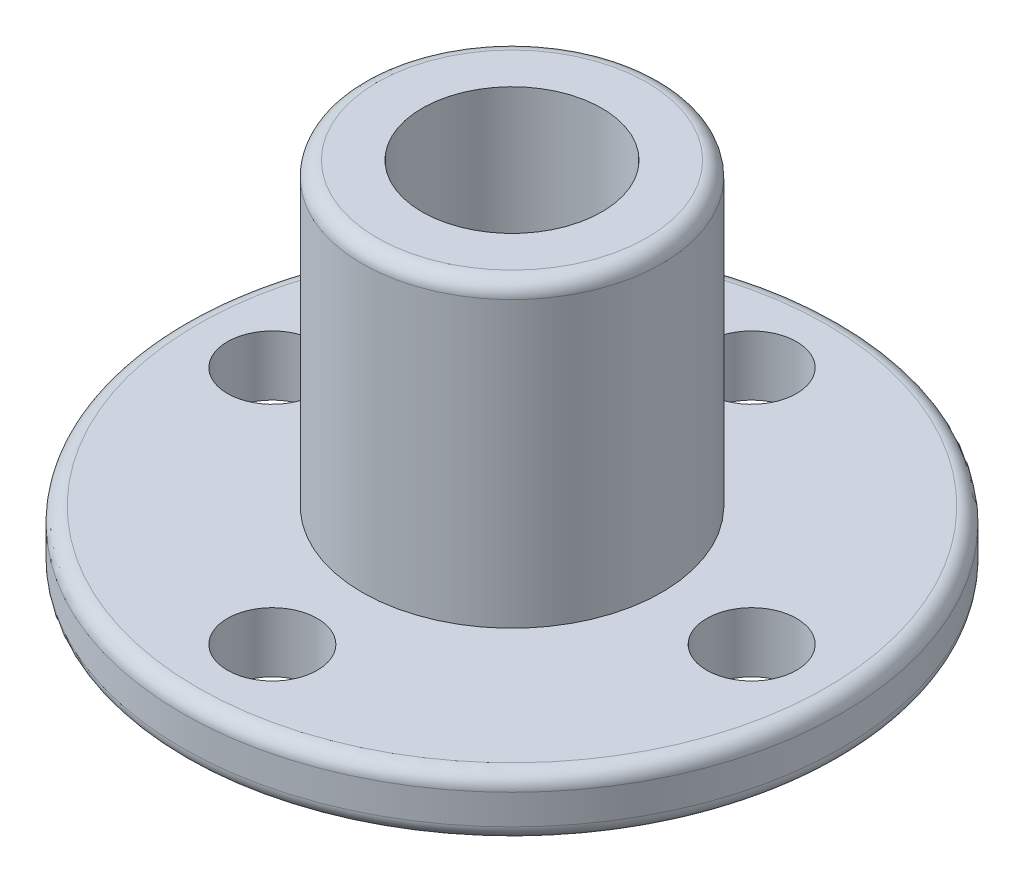
ISO-10303-21;
HEADER;
FILE_DESCRIPTION(('STEP AP214'),'2;1');
FILE_NAME('part.step','',(''),(''),'','','');
FILE_SCHEMA(('AUTOMOTIVE_DESIGN { 1 0 10303 214 1 1 1 1 }'));
ENDSEC;
DATA;
#1=APPLICATION_CONTEXT('core data for automotive mechanical design processes');
#2=APPLICATION_PROTOCOL_DEFINITION('international standard','automotive_design',2000,#1);
#3=PRODUCT_CONTEXT('',#1,'mechanical');
#4=PRODUCT('Part','Part','',(#3));
#5=PRODUCT_RELATED_PRODUCT_CATEGORY('part','',(#4));
#6=PRODUCT_DEFINITION_FORMATION('','',#4);
#7=PRODUCT_DEFINITION_CONTEXT('part definition',#1,'design');
#8=PRODUCT_DEFINITION('design','',#6,#7);
#9=PRODUCT_DEFINITION_SHAPE('','',#8);
#10=(LENGTH_UNIT() NAMED_UNIT(*) SI_UNIT(.MILLI.,.METRE.));
#11=(NAMED_UNIT(*) PLANE_ANGLE_UNIT() SI_UNIT($,.RADIAN.));
#12=(NAMED_UNIT(*) SI_UNIT($,.STERADIAN.) SOLID_ANGLE_UNIT());
#13=UNCERTAINTY_MEASURE_WITH_UNIT(LENGTH_MEASURE(1.E-05),#10,'distance_accuracy_value','');
#14=(GEOMETRIC_REPRESENTATION_CONTEXT(3) GLOBAL_UNCERTAINTY_ASSIGNED_CONTEXT((#13)) GLOBAL_UNIT_ASSIGNED_CONTEXT((#10,
#11,#12)) REPRESENTATION_CONTEXT('',''));
#15=CARTESIAN_POINT('',(0.,0.,0.));
#16=DIRECTION('',(0.,0.,1.));
#17=DIRECTION('',(1.,0.,0.));
#18=AXIS2_PLACEMENT_3D('',#15,#16,#17);
#19=CARTESIAN_POINT('',(0.,2.,0.));
#20=DIRECTION('',(0.,-1.,0.));
#21=DIRECTION('',(0.,0.,-1.));
#22=AXIS2_PLACEMENT_3D('',#19,#20,#21);
#23=CYLINDRICAL_SURFACE('',#22,11.);
#24=CARTESIAN_POINT('',(0.,0.5,0.));
#25=DIRECTION('',(0.,1.,0.));
#26=DIRECTION('',(0.,0.,1.));
#27=AXIS2_PLACEMENT_3D('',#24,#25,#26);
#28=CIRCLE('',#27,11.);
#29=CARTESIAN_POINT('',(0.,0.5,11.));
#30=VERTEX_POINT('',#29);
#31=EDGE_CURVE('E57',#30,#30,#28,.T.);
#32=ORIENTED_EDGE('',*,*,#31,.T.);
#33=EDGE_LOOP('',(#32));
#34=FACE_BOUND('',#33,.T.);
#35=CARTESIAN_POINT('',(0.,1.5,0.));
#36=DIRECTION('',(0.,1.,0.));
#37=DIRECTION('',(0.,0.,1.));
#38=AXIS2_PLACEMENT_3D('',#35,#36,#37);
#39=CIRCLE('',#38,11.);
#40=CARTESIAN_POINT('',(0.,1.5,11.));
#41=VERTEX_POINT('',#40);
#42=EDGE_CURVE('E60',#41,#41,#39,.F.);
#43=ORIENTED_EDGE('',*,*,#42,.T.);
#44=EDGE_LOOP('',(#43));
#45=FACE_BOUND('',#44,.T.);
#46=ADVANCED_FACE('F37',(#34,#45),#23,.T.);
#47=CARTESIAN_POINT('',(0.,2.,0.));
#48=DIRECTION('',(0.,1.,0.));
#49=DIRECTION('',(0.,0.,1.));
#50=AXIS2_PLACEMENT_3D('',#47,#48,#49);
#51=PLANE('',#50);
#52=CARTESIAN_POINT('',(0.,2.,0.));
#53=DIRECTION('',(0.,1.,0.));
#54=DIRECTION('',(0.,0.,1.));
#55=AXIS2_PLACEMENT_3D('',#52,#53,#54);
#56=CIRCLE('',#55,10.5);
#57=CARTESIAN_POINT('',(0.,2.,10.5));
#58=VERTEX_POINT('',#57);
#59=EDGE_CURVE('E48',#58,#58,#56,.T.);
#60=ORIENTED_EDGE('',*,*,#59,.T.);
#61=EDGE_LOOP('',(#60));
#62=FACE_BOUND('',#61,.T.);
#63=CARTESIAN_POINT('',(0.,2.,0.));
#64=DIRECTION('',(0.,1.,0.));
#65=DIRECTION('',(0.,0.,1.));
#66=AXIS2_PLACEMENT_3D('',#63,#64,#65);
#67=CIRCLE('',#66,5.);
#68=CARTESIAN_POINT('',(0.,2.,5.));
#69=VERTEX_POINT('',#68);
#70=EDGE_CURVE('E68',#69,#69,#67,.T.);
#71=ORIENTED_EDGE('',*,*,#70,.F.);
#72=EDGE_LOOP('',(#71));
#73=FACE_BOUND('',#72,.T.);
#74=CARTESIAN_POINT('',(0.,2.,-8.));
#75=DIRECTION('',(0.,1.,0.));
#76=DIRECTION('',(0.,0.,1.));
#77=AXIS2_PLACEMENT_3D('',#74,#75,#76);
#78=CIRCLE('',#77,1.5);
#79=CARTESIAN_POINT('',(0.,2.,-6.5));
#80=VERTEX_POINT('',#79);
#81=EDGE_CURVE('E83',#80,#80,#78,.T.);
#82=ORIENTED_EDGE('',*,*,#81,.F.);
#83=EDGE_LOOP('',(#82));
#84=FACE_BOUND('',#83,.T.);
#85=CARTESIAN_POINT('',(8.,2.,0.));
#86=DIRECTION('',(0.,1.,0.));
#87=DIRECTION('',(0.,0.,1.));
#88=AXIS2_PLACEMENT_3D('',#85,#86,#87);
#89=CIRCLE('',#88,1.5);
#90=CARTESIAN_POINT('',(8.,2.,1.5));
#91=VERTEX_POINT('',#90);
#92=EDGE_CURVE('E80',#91,#91,#89,.T.);
#93=ORIENTED_EDGE('',*,*,#92,.F.);
#94=EDGE_LOOP('',(#93));
#95=FACE_BOUND('',#94,.T.);
#96=CARTESIAN_POINT('',(0.,2.,8.));
#97=DIRECTION('',(0.,1.,0.));
#98=DIRECTION('',(0.,0.,1.));
#99=AXIS2_PLACEMENT_3D('',#96,#97,#98);
#100=CIRCLE('',#99,1.5);
#101=CARTESIAN_POINT('',(0.,2.,9.5));
#102=VERTEX_POINT('',#101);
#103=EDGE_CURVE('E74',#102,#102,#100,.T.);
#104=ORIENTED_EDGE('',*,*,#103,.F.);
#105=EDGE_LOOP('',(#104));
#106=FACE_BOUND('',#105,.T.);
#107=CARTESIAN_POINT('',(-8.,2.,0.));
#108=DIRECTION('',(0.,1.,0.));
#109=DIRECTION('',(0.,0.,1.));
#110=AXIS2_PLACEMENT_3D('',#107,#108,#109);
#111=CIRCLE('',#110,1.5);
#112=CARTESIAN_POINT('',(-8.,2.,1.5));
#113=VERTEX_POINT('',#112);
#114=EDGE_CURVE('E67',#113,#113,#111,.T.);
#115=ORIENTED_EDGE('',*,*,#114,.F.);
#116=EDGE_LOOP('',(#115));
#117=FACE_BOUND('',#116,.T.);
#118=ADVANCED_FACE('F146',(#62,#73,#84,#95,#106,#117),#51,.T.);
#119=CARTESIAN_POINT('',(0.,0.,0.));
#120=DIRECTION('',(0.,1.,0.));
#121=DIRECTION('',(0.,0.,1.));
#122=AXIS2_PLACEMENT_3D('',#119,#120,#121);
#123=PLANE('',#122);
#124=CARTESIAN_POINT('',(0.,0.,0.));
#125=DIRECTION('',(0.,1.,0.));
#126=DIRECTION('',(0.,0.,1.));
#127=AXIS2_PLACEMENT_3D('',#124,#125,#126);
#128=CIRCLE('',#127,10.5);
#129=CARTESIAN_POINT('',(0.,0.,10.5));
#130=VERTEX_POINT('',#129);
#131=EDGE_CURVE('E52',#130,#130,#128,.F.);
#132=ORIENTED_EDGE('',*,*,#131,.T.);
#133=EDGE_LOOP('',(#132));
#134=FACE_BOUND('',#133,.T.);
#135=CARTESIAN_POINT('',(0.,0.,0.));
#136=DIRECTION('',(0.,1.,0.));
#137=DIRECTION('',(0.,0.,1.));
#138=AXIS2_PLACEMENT_3D('',#135,#136,#137);
#139=CIRCLE('',#138,3.);
#140=CARTESIAN_POINT('',(0.,0.,3.));
#141=VERTEX_POINT('',#140);
#142=EDGE_CURVE('E90',#141,#141,#139,.T.);
#143=ORIENTED_EDGE('',*,*,#142,.T.);
#144=EDGE_LOOP('',(#143));
#145=FACE_BOUND('',#144,.T.);
#146=CARTESIAN_POINT('',(0.,0.,-8.));
#147=DIRECTION('',(0.,1.,0.));
#148=DIRECTION('',(0.,0.,1.));
#149=AXIS2_PLACEMENT_3D('',#146,#147,#148);
#150=CIRCLE('',#149,1.5);
#151=CARTESIAN_POINT('',(0.,0.,-6.5));
#152=VERTEX_POINT('',#151);
#153=EDGE_CURVE('E63',#152,#152,#150,.T.);
#154=ORIENTED_EDGE('',*,*,#153,.T.);
#155=EDGE_LOOP('',(#154));
#156=FACE_BOUND('',#155,.T.);
#157=CARTESIAN_POINT('',(8.,0.,0.));
#158=DIRECTION('',(0.,1.,0.));
#159=DIRECTION('',(0.,0.,1.));
#160=AXIS2_PLACEMENT_3D('',#157,#158,#159);
#161=CIRCLE('',#160,1.5);
#162=CARTESIAN_POINT('',(8.,0.,1.5));
#163=VERTEX_POINT('',#162);
#164=EDGE_CURVE('E77',#163,#163,#161,.T.);
#165=ORIENTED_EDGE('',*,*,#164,.T.);
#166=EDGE_LOOP('',(#165));
#167=FACE_BOUND('',#166,.T.);
#168=CARTESIAN_POINT('',(0.,0.,8.));
#169=DIRECTION('',(0.,1.,0.));
#170=DIRECTION('',(0.,0.,1.));
#171=AXIS2_PLACEMENT_3D('',#168,#169,#170);
#172=CIRCLE('',#171,1.5);
#173=CARTESIAN_POINT('',(0.,0.,9.5));
#174=VERTEX_POINT('',#173);
#175=EDGE_CURVE('E71',#174,#174,#172,.T.);
#176=ORIENTED_EDGE('',*,*,#175,.T.);
#177=EDGE_LOOP('',(#176));
#178=FACE_BOUND('',#177,.T.);
#179=CARTESIAN_POINT('',(-8.,0.,0.));
#180=DIRECTION('',(0.,1.,0.));
#181=DIRECTION('',(0.,0.,1.));
#182=AXIS2_PLACEMENT_3D('',#179,#180,#181);
#183=CIRCLE('',#182,1.5);
#184=CARTESIAN_POINT('',(-8.,0.,1.5));
#185=VERTEX_POINT('',#184);
#186=EDGE_CURVE('E64',#185,#185,#183,.T.);
#187=ORIENTED_EDGE('',*,*,#186,.T.);
#188=EDGE_LOOP('',(#187));
#189=FACE_BOUND('',#188,.T.);
#190=ADVANCED_FACE('F144',(#134,#145,#156,#167,#178,#189),#123,.F.);
#191=CARTESIAN_POINT('',(-8.,0.,0.));
#192=DIRECTION('',(0.,1.,0.));
#193=DIRECTION('',(0.,0.,1.));
#194=AXIS2_PLACEMENT_3D('',#191,#192,#193);
#195=CYLINDRICAL_SURFACE('',#194,1.5);
#196=ORIENTED_EDGE('',*,*,#186,.F.);
#197=EDGE_LOOP('',(#196));
#198=FACE_BOUND('',#197,.T.);
#199=ORIENTED_EDGE('',*,*,#114,.T.);
#200=EDGE_LOOP('',(#199));
#201=FACE_BOUND('',#200,.T.);
#202=ADVANCED_FACE('F140',(#198,#201),#195,.F.);
#203=CARTESIAN_POINT('',(0.,0.,8.));
#204=DIRECTION('',(0.,1.,0.));
#205=DIRECTION('',(0.,0.,1.));
#206=AXIS2_PLACEMENT_3D('',#203,#204,#205);
#207=CYLINDRICAL_SURFACE('',#206,1.5);
#208=ORIENTED_EDGE('',*,*,#175,.F.);
#209=EDGE_LOOP('',(#208));
#210=FACE_BOUND('',#209,.T.);
#211=ORIENTED_EDGE('',*,*,#103,.T.);
#212=EDGE_LOOP('',(#211));
#213=FACE_BOUND('',#212,.T.);
#214=ADVANCED_FACE('F136',(#210,#213),#207,.F.);
#215=CARTESIAN_POINT('',(8.,0.,0.));
#216=DIRECTION('',(0.,1.,0.));
#217=DIRECTION('',(0.,0.,1.));
#218=AXIS2_PLACEMENT_3D('',#215,#216,#217);
#219=CYLINDRICAL_SURFACE('',#218,1.5);
#220=ORIENTED_EDGE('',*,*,#164,.F.);
#221=EDGE_LOOP('',(#220));
#222=FACE_BOUND('',#221,.T.);
#223=ORIENTED_EDGE('',*,*,#92,.T.);
#224=EDGE_LOOP('',(#223));
#225=FACE_BOUND('',#224,.T.);
#226=ADVANCED_FACE('F132',(#222,#225),#219,.F.);
#227=CARTESIAN_POINT('',(0.,0.,-8.));
#228=DIRECTION('',(0.,1.,0.));
#229=DIRECTION('',(0.,0.,1.));
#230=AXIS2_PLACEMENT_3D('',#227,#228,#229);
#231=CYLINDRICAL_SURFACE('',#230,1.5);
#232=ORIENTED_EDGE('',*,*,#153,.F.);
#233=EDGE_LOOP('',(#232));
#234=FACE_BOUND('',#233,.T.);
#235=ORIENTED_EDGE('',*,*,#81,.T.);
#236=EDGE_LOOP('',(#235));
#237=FACE_BOUND('',#236,.T.);
#238=ADVANCED_FACE('F128',(#234,#237),#231,.F.);
#239=CARTESIAN_POINT('',(0.,12.,0.));
#240=DIRECTION('',(0.,-1.,0.));
#241=DIRECTION('',(0.,0.,-1.));
#242=AXIS2_PLACEMENT_3D('',#239,#240,#241);
#243=CYLINDRICAL_SURFACE('',#242,5.);
#244=CARTESIAN_POINT('',(1.5,7.,-4.76969600708473));
#245=CARTESIAN_POINT('',(1.49999897633764,6.9178054520576,-4.7696968572698));
#246=CARTESIAN_POINT('',(1.49322108167142,6.83560077585598,-4.77184390209069));
#247=CARTESIAN_POINT('',(1.46635844446749,6.67359475040806,-4.780165783029));
#248=CARTESIAN_POINT('',(1.44626925573578,6.59379421349853,-4.78634196493468));
#249=CARTESIAN_POINT('',(1.39352753269955,6.43896527172827,-4.80196102485633));
#250=CARTESIAN_POINT('',(1.36089589394243,6.36392917036691,-4.81139846703232));
#251=CARTESIAN_POINT('',(1.28406421917929,6.2203780660047,-4.83246932547567));
#252=CARTESIAN_POINT('',(1.23986245137053,6.15186404131556,-4.8441030704102));
#253=CARTESIAN_POINT('',(1.13964754141627,6.02113360942262,-4.86866862185766));
#254=CARTESIAN_POINT('',(1.08333207175807,5.95915410205371,-4.88162808311636));
#255=CARTESIAN_POINT('',(0.961136237579598,5.84536204867749,-4.90714861936757));
#256=CARTESIAN_POINT('',(0.895254645461111,5.79355080955012,-4.91970964297705));
#257=CARTESIAN_POINT('',(0.754111437793689,5.70053730016669,-4.94333214579389));
#258=CARTESIAN_POINT('',(0.678684021335814,5.65957657555719,-4.95435724342404));
#259=CARTESIAN_POINT('',(0.521624645369353,5.59101274095724,-4.97334435920684));
#260=CARTESIAN_POINT('',(0.43999402838791,5.56340675014255,-4.98130703789496));
#261=CARTESIAN_POINT('',(0.275323852630828,5.52311999890949,-4.9930764600359));
#262=CARTESIAN_POINT('',(0.192391398953799,5.5100348723473,-4.99699557369339));
#263=CARTESIAN_POINT('',(0.0254218237493133,5.49788267535356,-5.00063201501348));
#264=CARTESIAN_POINT('',(-0.0586150620503699,5.49881266059804,-5.00035022521079));
#265=CARTESIAN_POINT('',(-0.222571156600162,5.51439286854302,-4.99569603817659));
#266=CARTESIAN_POINT('',(-0.302536267641343,5.52860519380987,-4.9914542020526));
#267=CARTESIAN_POINT('',(-0.458889213442528,5.56963133599429,-4.97951522112593));
#268=CARTESIAN_POINT('',(-0.535276821322847,5.59644595094267,-4.97181785750586));
#269=CARTESIAN_POINT('',(-0.683347326351282,5.66221202341856,-4.95365220986963));
#270=CARTESIAN_POINT('',(-0.75496506469448,5.70130120280727,-4.94315269676706));
#271=CARTESIAN_POINT('',(-0.890764673783157,5.79039785242823,-4.92049640648069));
#272=CARTESIAN_POINT('',(-0.954944774872132,5.84040791296349,-4.90833923637778));
#273=CARTESIAN_POINT('',(-1.0766604815298,5.9521977507516,-4.88311550488166));
#274=CARTESIAN_POINT('',(-1.13384458040112,6.01435691902974,-4.87003195321461));
#275=CARTESIAN_POINT('',(-1.23707651539824,6.14751001789005,-4.84483979887497));
#276=CARTESIAN_POINT('',(-1.28312324482853,6.21850482538923,-4.8327312931702));
#277=CARTESIAN_POINT('',(-1.3631399533545,6.36823946924899,-4.81077903197678));
#278=CARTESIAN_POINT('',(-1.39698989237679,6.44704704586292,-4.80095810695957));
#279=CARTESIAN_POINT('',(-1.45083362878413,6.60960720844555,-4.78496392548436));
#280=CARTESIAN_POINT('',(-1.4708319464056,6.69335817153456,-4.7787894791583));
#281=CARTESIAN_POINT('',(-1.49574770282165,6.86008236073928,-4.77104849541242));
#282=CARTESIAN_POINT('',(-1.50119946380212,6.94296822389398,-4.76931878670441));
#283=CARTESIAN_POINT('',(-1.49835947233062,7.10847290000987,-4.77021192441924));
#284=CARTESIAN_POINT('',(-1.4900696437133,7.19109174873085,-4.77283416156589));
#285=CARTESIAN_POINT('',(-1.4604576357419,7.35148837797087,-4.78197558554912));
#286=CARTESIAN_POINT('',(-1.4394796143128,7.42933616426352,-4.78839176507489));
#287=CARTESIAN_POINT('',(-1.3854857774794,7.58040169081492,-4.80429141231227));
#288=CARTESIAN_POINT('',(-1.3524681034276,7.65361871414057,-4.81377535359073));
#289=CARTESIAN_POINT('',(-1.274318711965,7.79551746407213,-4.83505835023047));
#290=CARTESIAN_POINT('',(-1.22888564172729,7.86402472098579,-4.84691271069799));
#291=CARTESIAN_POINT('',(-1.12755301600385,7.9926381061808,-4.87148205646987));
#292=CARTESIAN_POINT('',(-1.07165095534897,8.05274221761279,-4.88419724730003));
#293=CARTESIAN_POINT('',(-0.948455132493598,8.16518040581474,-4.90963633548158));
#294=CARTESIAN_POINT('',(-0.880811065857434,8.21713562898698,-4.92234245063004));
#295=CARTESIAN_POINT('',(-0.737461784590248,8.30896670102775,-4.94584851748651));
#296=CARTESIAN_POINT('',(-0.661756970543943,8.34884314978146,-4.95664856384717));
#297=CARTESIAN_POINT('',(-0.50493550470522,8.4150000305683,-4.97505970474957));
#298=CARTESIAN_POINT('',(-0.423864622037837,8.44138201615898,-4.98269453424966));
#299=CARTESIAN_POINT('',(-0.258169966504586,8.48006091889042,-4.99401979596827));
#300=CARTESIAN_POINT('',(-0.173547217354761,8.49236186594842,-4.9977113567088));
#301=CARTESIAN_POINT('',(-0.00665215388274161,8.5022230440545,-5.00066544081399));
#302=CARTESIAN_POINT('',(0.0755851790862079,8.50033269540783,-5.00009305111322));
#303=CARTESIAN_POINT('',(0.238519481164405,8.48317836750088,-4.99497264465037));
#304=CARTESIAN_POINT('',(0.31921653734653,8.46791514651956,-4.99042485330463));
#305=CARTESIAN_POINT('',(0.475935813041359,8.42478833860038,-4.97791168358327));
#306=CARTESIAN_POINT('',(0.551998927351393,8.39706181935099,-4.96998352900866));
#307=CARTESIAN_POINT('',(0.698433237752054,8.32991808549281,-4.9515294303945));
#308=CARTESIAN_POINT('',(0.768803496050581,8.29049894971381,-4.94100305949946));
#309=CARTESIAN_POINT('',(0.904301892420564,8.19962654256996,-4.91803965828228));
#310=CARTESIAN_POINT('',(0.969190250076767,8.14782856999923,-4.90555226923559));
#311=CARTESIAN_POINT('',(1.08953757134594,8.0342896116672,-4.88023537212334));
#312=CARTESIAN_POINT('',(1.14499380960194,7.97254576210185,-4.86740576641079));
#313=CARTESIAN_POINT('',(1.24656269394549,7.83865922168949,-4.84240680631319));
#314=CARTESIAN_POINT('',(1.29234759757956,7.76626144660956,-4.83026852693485));
#315=CARTESIAN_POINT('',(1.37104313528776,7.61444482583898,-4.80852547508793));
#316=CARTESIAN_POINT('',(1.40395995557289,7.5350293763988,-4.79891948596956));
#317=CARTESIAN_POINT('',(1.4530194253295,7.38025956839372,-4.78427816717595));
#318=CARTESIAN_POINT('',(1.47058859011232,7.30539135306901,-4.7788615484052));
#319=CARTESIAN_POINT('',(1.49407818835144,7.15368477750423,-4.77157042597167));
#320=CARTESIAN_POINT('',(1.50000095706095,7.07684681535475,-4.76969521221431));
#321=CARTESIAN_POINT('',(1.5,7.,-4.76969600708473));
#322=B_SPLINE_CURVE_WITH_KNOTS('',3,(#244,#245,#246,#247,#248,#249,#250,#251,#252,#253,#254,
#255,#256,#257,#258,#259,#260,#261,#262,#263,#264,#265,#266,#267,#268,#269,#270,#271,#272,#273,
#274,#275,#276,#277,#278,#279,#280,#281,#282,#283,#284,#285,#286,#287,#288,#289,#290,#291,#292,
#293,#294,#295,#296,#297,#298,#299,#300,#301,#302,#303,#304,#305,#306,#307,#308,#309,#310,#311,
#312,#313,#314,#315,#316,#317,#318,#319,#320,#321),.UNSPECIFIED.,.T.,.F.,(4,2,2,2,2,2,2,2,2,2,2,
2,2,2,2,2,2,2,2,2,2,2,2,2,2,2,2,2,2,2,2,2,2,2,2,2,2,2,4),(0.,0.246300165915542,
0.492682641689001,0.738656414466194,0.984667025370102,1.23773150007984,1.49082847871273,
1.74915939273645,2.00743455587877,2.25832140149558,2.5091555410144,2.7520012599088,
2.99486235890376,3.24055209335676,3.48630016590831,3.74152147023278,3.99676812491863,
4.25446238246266,4.51207250628411,4.76008080790309,5.00805439107388,5.24958594938817,
5.49115481045787,5.73920731809389,5.98731925928923,6.24479506100602,6.50225807324202,
6.75775391814325,7.01317662321682,7.2587630391122,7.50433553047755,7.74727096872219,
7.99024634491378,8.24099627054488,8.4918185262989,8.75011639669147,9.00828993963944,
9.23861153857448,9.4688869503356),.UNSPECIFIED.);
#323=CARTESIAN_POINT('',(1.5,7.,-4.76969600708473));
#324=VERTEX_POINT('',#323);
#325=EDGE_CURVE('E94',#324,#324,#322,.T.);
#326=ORIENTED_EDGE('',*,*,#325,.F.);
#327=EDGE_LOOP('',(#326));
#328=FACE_BOUND('',#327,.T.);
#329=CARTESIAN_POINT('',(0.,11.5,0.));
#330=DIRECTION('',(0.,1.,0.));
#331=DIRECTION('',(0.,0.,1.));
#332=AXIS2_PLACEMENT_3D('',#329,#330,#331);
#333=CIRCLE('',#332,5.);
#334=CARTESIAN_POINT('',(0.,11.5,5.));
#335=VERTEX_POINT('',#334);
#336=EDGE_CURVE('E10',#335,#335,#333,.F.);
#337=ORIENTED_EDGE('',*,*,#336,.T.);
#338=EDGE_LOOP('',(#337));
#339=FACE_BOUND('',#338,.T.);
#340=ORIENTED_EDGE('',*,*,#70,.T.);
#341=EDGE_LOOP('',(#340));
#342=FACE_BOUND('',#341,.T.);
#343=ADVANCED_FACE('F125',(#328,#339,#342),#243,.T.);
#344=CARTESIAN_POINT('',(0.,12.,0.));
#345=DIRECTION('',(0.,1.,0.));
#346=DIRECTION('',(0.,0.,1.));
#347=AXIS2_PLACEMENT_3D('',#344,#345,#346);
#348=PLANE('',#347);
#349=CARTESIAN_POINT('',(0.,12.,0.));
#350=DIRECTION('',(0.,1.,0.));
#351=DIRECTION('',(0.,0.,1.));
#352=AXIS2_PLACEMENT_3D('',#349,#350,#351);
#353=CIRCLE('',#352,4.5);
#354=CARTESIAN_POINT('',(0.,12.,4.5));
#355=VERTEX_POINT('',#354);
#356=EDGE_CURVE('E44',#355,#355,#353,.T.);
#357=ORIENTED_EDGE('',*,*,#356,.T.);
#358=EDGE_LOOP('',(#357));
#359=FACE_BOUND('',#358,.T.);
#360=CARTESIAN_POINT('',(0.,12.,0.));
#361=DIRECTION('',(0.,1.,0.));
#362=DIRECTION('',(0.,0.,1.));
#363=AXIS2_PLACEMENT_3D('',#360,#361,#362);
#364=CIRCLE('',#363,3.);
#365=CARTESIAN_POINT('',(0.,12.,3.));
#366=VERTEX_POINT('',#365);
#367=EDGE_CURVE('E91',#366,#366,#364,.T.);
#368=ORIENTED_EDGE('',*,*,#367,.F.);
#369=EDGE_LOOP('',(#368));
#370=FACE_BOUND('',#369,.T.);
#371=ADVANCED_FACE('F121',(#359,#370),#348,.T.);
#372=CARTESIAN_POINT('',(0.,0.,0.));
#373=DIRECTION('',(0.,1.,0.));
#374=DIRECTION('',(0.,0.,1.));
#375=AXIS2_PLACEMENT_3D('',#372,#373,#374);
#376=CYLINDRICAL_SURFACE('',#375,3.);
#377=CARTESIAN_POINT('',(1.5,7.,-2.59807621135332));
#378=CARTESIAN_POINT('',(1.4999945446118,7.07816171229288,-2.59808302092689));
#379=CARTESIAN_POINT('',(1.49384995609983,7.15642211728757,-2.60165701781635));
#380=CARTESIAN_POINT('',(1.46958481484708,7.31054089701573,-2.61543549678079));
#381=CARTESIAN_POINT('',(1.45143909683127,7.38639387256511,-2.62565391083339));
#382=CARTESIAN_POINT('',(1.40414992304972,7.53317749651591,-2.65124019908098));
#383=CARTESIAN_POINT('',(1.3750649287406,7.60413197871038,-2.66658065209878));
#384=CARTESIAN_POINT('',(1.30690128806456,7.74013630299508,-2.70063997225287));
#385=CARTESIAN_POINT('',(1.26782210105366,7.80518582539368,-2.71935902214097));
#386=CARTESIAN_POINT('',(1.17699981079632,7.93345859283626,-2.75995303586162));
#387=CARTESIAN_POINT('',(1.12447805421566,7.99608870351031,-2.7819609545693));
#388=CARTESIAN_POINT('',(1.0098807114217,8.11211258261006,-2.82557974178559));
#389=CARTESIAN_POINT('',(0.94780038867344,8.16550174387528,-2.84719040746875));
#390=CARTESIAN_POINT('',(0.810734345121819,8.26505072672149,-2.88932215429424));
#391=CARTESIAN_POINT('',(0.735160783518862,8.3104806517893,-2.90967159627259));
#392=CARTESIAN_POINT('',(0.576235539899256,8.38771127986865,-2.94526134149294));
#393=CARTESIAN_POINT('',(0.492888807207233,8.41952058420575,-2.96050486775612));
#394=CARTESIAN_POINT('',(0.327067415888966,8.46625699195165,-2.98320691866356));
#395=CARTESIAN_POINT('',(0.244952685733227,8.4822242895333,-2.99114220331338));
#396=CARTESIAN_POINT('',(0.0788559430467726,8.50024917801256,-3.00011375769101));
#397=CARTESIAN_POINT('',(-0.00512490876560758,8.50231518519356,-3.00115420176885));
#398=CARTESIAN_POINT('',(-0.164748786635625,8.49287998904448,-2.99644472874675));
#399=CARTESIAN_POINT('',(-0.240481798765187,8.48254297671817,-2.99127743838241));
#400=CARTESIAN_POINT('',(-0.388970657877483,8.45067873414301,-2.97561367889621));
#401=CARTESIAN_POINT('',(-0.461726281640888,8.42915066653567,-2.96511681099591));
#402=CARTESIAN_POINT('',(-0.60346408735433,8.37537615086528,-2.93957374931482));
#403=CARTESIAN_POINT('',(-0.672380135272767,8.3429855302419,-2.92446662293799));
#404=CARTESIAN_POINT('',(-0.803965202269993,8.26860487569776,-2.89106468980031));
#405=CARTESIAN_POINT('',(-0.866631973257969,8.22661140504647,-2.87276874236226));
#406=CARTESIAN_POINT('',(-0.990260491347292,8.12965697270048,-2.83266591598844));
#407=CARTESIAN_POINT('',(-1.05050111254404,8.07384545751099,-2.81069063997263));
#408=CARTESIAN_POINT('',(-1.16115655544667,7.95311541260474,-2.76681510880217));
#409=CARTESIAN_POINT('',(-1.21156381736135,7.88818994158891,-2.74491492398443));
#410=CARTESIAN_POINT('',(-1.30425800196332,7.74602771136387,-2.70216234138727));
#411=CARTESIAN_POINT('',(-1.34582597246708,7.66827096541869,-2.68146479986061));
#412=CARTESIAN_POINT('',(-1.41497866950185,7.5055934929615,-2.64563175417864));
#413=CARTESIAN_POINT('',(-1.44257798731633,7.42068035047366,-2.63049045069101));
#414=CARTESIAN_POINT('',(-1.48077031653756,7.25317823307581,-2.60916953725552));
#415=CARTESIAN_POINT('',(-1.49253768317996,7.17093832143467,-2.60237483772745));
#416=CARTESIAN_POINT('',(-1.50227541991714,7.00539798772519,-2.59676879042414));
#417=CARTESIAN_POINT('',(-1.50025553597254,6.92209835632032,-2.59795180333967));
#418=CARTESIAN_POINT('',(-1.48355406501595,6.76651912213191,-2.60751504810877));
#419=CARTESIAN_POINT('',(-1.4702817250687,6.69403082333811,-2.61509381259981));
#420=CARTESIAN_POINT('',(-1.43354442694866,6.55244832059356,-2.63541032327012));
#421=CARTESIAN_POINT('',(-1.41007616793542,6.48335522388009,-2.64814974007551));
#422=CARTESIAN_POINT('',(-1.35247138290733,6.34688300364596,-2.67804333119485));
#423=CARTESIAN_POINT('',(-1.31789109553908,6.27973147471967,-2.69537464864595));
#424=CARTESIAN_POINT('',(-1.23943059602371,6.15179609269151,-2.73234179245875));
#425=CARTESIAN_POINT('',(-1.19554560649832,6.09101553473007,-2.75197880032721));
#426=CARTESIAN_POINT('',(-1.09325575079828,5.96953184871468,-2.79431997684504));
#427=CARTESIAN_POINT('',(-1.03371790847245,5.90980427392351,-2.81709874731434));
#428=CARTESIAN_POINT('',(-0.905106743097433,5.80088164300961,-2.86101352466839));
#429=CARTESIAN_POINT('',(-0.836030211983021,5.75169014465419,-2.88214897511564));
#430=CARTESIAN_POINT('',(-0.687803043838136,5.66413941107485,-2.92112042536435));
#431=CARTESIAN_POINT('',(-0.60843464636117,5.62610032268364,-2.93885462508044));
#432=CARTESIAN_POINT('',(-0.443283546961623,5.56429314421391,-2.96825032438951));
#433=CARTESIAN_POINT('',(-0.357506552088264,5.54051252295054,-2.9799171551456));
#434=CARTESIAN_POINT('',(-0.190469523495626,5.50994715373801,-2.99501262272824));
#435=CARTESIAN_POINT('',(-0.109517165775686,5.50180318618583,-2.99909891862287));
#436=CARTESIAN_POINT('',(0.0526889789268051,5.4987351018184,-3.00063195562697));
#437=CARTESIAN_POINT('',(0.13394265044263,5.50380635721465,-2.99808102100335));
#438=CARTESIAN_POINT('',(0.28880698847572,5.52612461019344,-2.98700953256884));
#439=CARTESIAN_POINT('',(0.362568476716895,5.54254727388651,-2.97889342001985));
#440=CARTESIAN_POINT('',(0.506168928275426,5.58599049895446,-2.95788140495135));
#441=CARTESIAN_POINT('',(0.576007327433263,5.61301258014018,-2.94498481699194));
#442=CARTESIAN_POINT('',(0.713135109367327,5.67809057824896,-2.9148889612218));
#443=CARTESIAN_POINT('',(0.78018771405007,5.71656898481176,-2.89752925798199));
#444=CARTESIAN_POINT('',(0.907161962721037,5.80293689628858,-2.86032199712739));
#445=CARTESIAN_POINT('',(0.967080311122361,5.85083072367351,-2.84047329837541));
#446=CARTESIAN_POINT('',(1.08437100623534,5.96019570853405,-2.79792915339941));
#447=CARTESIAN_POINT('',(1.14089652680891,6.02254373121579,-2.77514698517547));
#448=CARTESIAN_POINT('',(1.24299493109201,6.15617608169465,-2.73094614244279));
#449=CARTESIAN_POINT('',(1.28855812501509,6.22746823130153,-2.70952868642798));
#450=CARTESIAN_POINT('',(1.36864661967848,6.37995496987143,-2.66999407957374));
#451=CARTESIAN_POINT('',(1.40277759894141,6.4613912966931,-2.65200261384405));
#452=CARTESIAN_POINT('',(1.45631806425962,6.62999860650967,-2.62299234492527));
#453=CARTESIAN_POINT('',(1.47577678676302,6.71714933336903,-2.61195024221553));
#454=CARTESIAN_POINT('',(1.49155051179662,6.837708033478,-2.60293908902686));
#455=CARTESIAN_POINT('',(1.49471415744578,6.87005184159682,-2.60112193507728));
#456=CARTESIAN_POINT('',(1.49894010763494,6.93492472102336,-2.59868903831625));
#457=CARTESIAN_POINT('',(1.50000227159981,6.96745380457881,-2.59807337587664));
#458=CARTESIAN_POINT('',(1.5,7.,-2.59807621135332));
#459=B_SPLINE_CURVE_WITH_KNOTS('',3,(#377,#378,#379,#380,#381,#382,#383,#384,#385,#386,#387,
#388,#389,#390,#391,#392,#393,#394,#395,#396,#397,#398,#399,#400,#401,#402,#403,#404,#405,#406,
#407,#408,#409,#410,#411,#412,#413,#414,#415,#416,#417,#418,#419,#420,#421,#422,#423,#424,#425,
#426,#427,#428,#429,#430,#431,#432,#433,#434,#435,#436,#437,#438,#439,#440,#441,#442,#443,#444,
#445,#446,#447,#448,#449,#450,#451,#452,#453,#454,#455,#456,#457,#458),.UNSPECIFIED.,.T.,.F.,(4,
2,2,2,2,2,2,2,2,2,2,2,2,2,2,2,2,2,2,2,2,2,2,2,2,2,2,2,2,2,2,2,2,2,2,2,2,2,2,2,4),(0.,
0.234348183892072,0.469189339237207,0.702792893878327,0.936409088167723,1.18929346874735,
1.44230356626556,1.71236838358145,1.98226240445837,2.23295227451903,2.4834903552906,
2.71224146226808,2.94100968776183,3.1729430209672,3.40495949025408,3.65890787185336,
3.91305072368878,4.18333262594173,4.45333161317557,4.70193436281318,4.9503613978256,
5.17161275136038,5.39293578654095,5.62450944609132,5.85620229330071,6.1171011537092,
6.37808797467303,6.64596272119449,6.91360169713157,7.1566840558423,7.39968130190957,
7.62666637307239,7.85368400268019,8.09041126079208,8.32724745151079,8.58765362775101,
8.84828914267731,9.11716123557907,9.3851269950414,9.48270202777964,9.58028358741811),.UNSPECIFIED.);
#460=CARTESIAN_POINT('',(1.5,7.,-2.59807621135332));
#461=VERTEX_POINT('',#460);
#462=EDGE_CURVE('E104',#461,#461,#459,.T.);
#463=ORIENTED_EDGE('',*,*,#462,.F.);
#464=EDGE_LOOP('',(#463));
#465=FACE_BOUND('',#464,.T.);
#466=ORIENTED_EDGE('',*,*,#142,.F.);
#467=EDGE_LOOP('',(#466));
#468=FACE_BOUND('',#467,.T.);
#469=ORIENTED_EDGE('',*,*,#367,.T.);
#470=EDGE_LOOP('',(#469));
#471=FACE_BOUND('',#470,.T.);
#472=ADVANCED_FACE('F116',(#465,#468,#471),#376,.F.);
#473=CARTESIAN_POINT('',(0.,0.5,0.));
#474=DIRECTION('',(0.,1.,0.));
#475=DIRECTION('',(0.,0.,1.));
#476=AXIS2_PLACEMENT_3D('',#473,#474,#475);
#477=TOROIDAL_SURFACE('',#476,10.5,0.5);
#478=ORIENTED_EDGE('',*,*,#131,.F.);
#479=EDGE_LOOP('',(#478));
#480=FACE_BOUND('',#479,.T.);
#481=ORIENTED_EDGE('',*,*,#31,.F.);
#482=EDGE_LOOP('',(#481));
#483=FACE_BOUND('',#482,.T.);
#484=ADVANCED_FACE('F120',(#480,#483),#477,.T.);
#485=CARTESIAN_POINT('',(0.,1.5,0.));
#486=DIRECTION('',(0.,1.,0.));
#487=DIRECTION('',(0.,0.,1.));
#488=AXIS2_PLACEMENT_3D('',#485,#486,#487);
#489=TOROIDAL_SURFACE('',#488,10.5,0.5);
#490=ORIENTED_EDGE('',*,*,#42,.F.);
#491=EDGE_LOOP('',(#490));
#492=FACE_BOUND('',#491,.T.);
#493=ORIENTED_EDGE('',*,*,#59,.F.);
#494=EDGE_LOOP('',(#493));
#495=FACE_BOUND('',#494,.T.);
#496=ADVANCED_FACE('F157',(#492,#495),#489,.T.);
#497=CARTESIAN_POINT('',(0.,11.5,0.));
#498=DIRECTION('',(0.,1.,0.));
#499=DIRECTION('',(0.,0.,1.));
#500=AXIS2_PLACEMENT_3D('',#497,#498,#499);
#501=TOROIDAL_SURFACE('',#500,4.5,0.5);
#502=ORIENTED_EDGE('',*,*,#336,.F.);
#503=EDGE_LOOP('',(#502));
#504=FACE_BOUND('',#503,.T.);
#505=ORIENTED_EDGE('',*,*,#356,.F.);
#506=EDGE_LOOP('',(#505));
#507=FACE_BOUND('',#506,.T.);
#508=ADVANCED_FACE('F39',(#504,#507),#501,.T.);
#509=CARTESIAN_POINT('',(0.,7.,-11.001));
#510=DIRECTION('',(0.,0.,1.));
#511=DIRECTION('',(1.,0.,0.));
#512=AXIS2_PLACEMENT_3D('',#509,#510,#511);
#513=CYLINDRICAL_SURFACE('',#512,1.5);
#514=ORIENTED_EDGE('',*,*,#462,.T.);
#515=EDGE_LOOP('',(#514));
#516=FACE_BOUND('',#515,.T.);
#517=ORIENTED_EDGE('',*,*,#325,.T.);
#518=EDGE_LOOP('',(#517));
#519=FACE_BOUND('',#518,.T.);
#520=ADVANCED_FACE('F109',(#516,#519),#513,.F.);
#521=CLOSED_SHELL('',(#46,#118,#190,#202,#214,#226,#238,#343,#371,#472,#484,#496,#508,#520));
#522=MANIFOLD_SOLID_BREP('B2',#521);
#523=ADVANCED_BREP_SHAPE_REPRESENTATION('',(#18,#522),#14);
#524=SHAPE_DEFINITION_REPRESENTATION(#9,#523);
ENDSEC;
END-ISO-10303-21;
